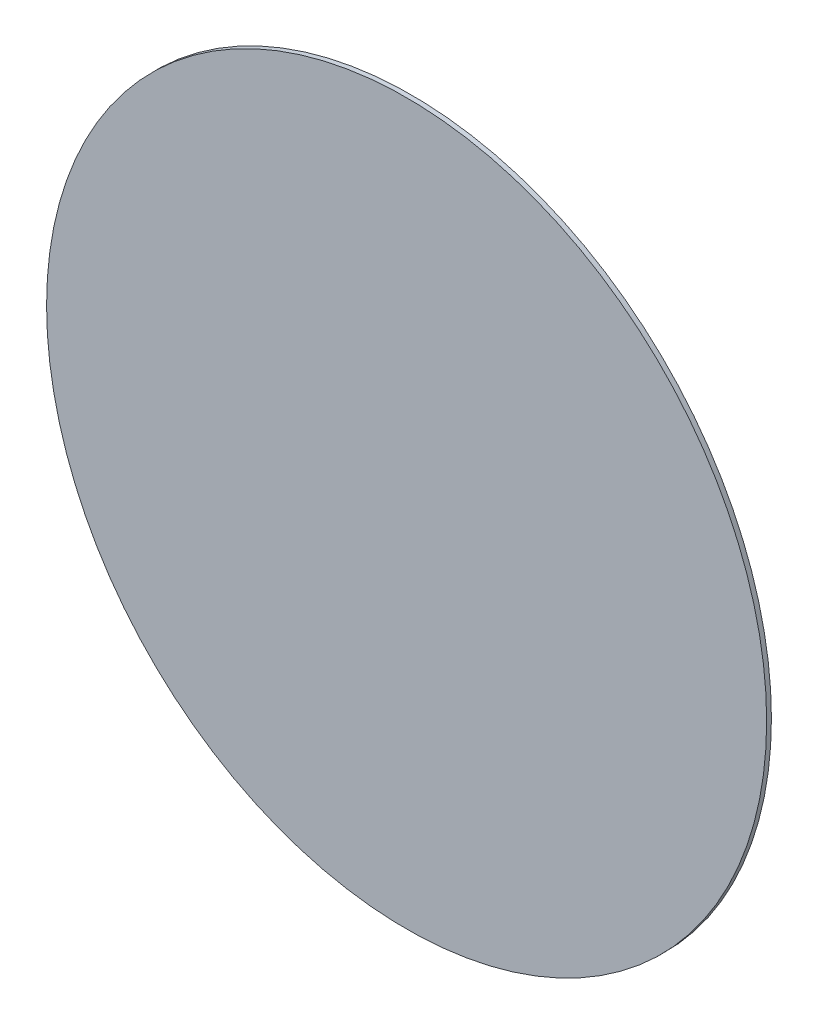
ISO-10303-21;
HEADER;
FILE_DESCRIPTION(('STEP AP214'),'2;1');
FILE_NAME('part.step','',(''),(''),'','','');
FILE_SCHEMA(('AUTOMOTIVE_DESIGN { 1 0 10303 214 1 1 1 1 }'));
ENDSEC;
DATA;
#1=APPLICATION_CONTEXT('core data for automotive mechanical design processes');
#2=APPLICATION_PROTOCOL_DEFINITION('international standard','automotive_design',2000,#1);
#3=PRODUCT_CONTEXT('',#1,'mechanical');
#4=PRODUCT('Part','Part','',(#3));
#5=PRODUCT_RELATED_PRODUCT_CATEGORY('part','',(#4));
#6=PRODUCT_DEFINITION_FORMATION('','',#4);
#7=PRODUCT_DEFINITION_CONTEXT('part definition',#1,'design');
#8=PRODUCT_DEFINITION('design','',#6,#7);
#9=PRODUCT_DEFINITION_SHAPE('','',#8);
#10=(LENGTH_UNIT() NAMED_UNIT(*) SI_UNIT(.MILLI.,.METRE.));
#11=(NAMED_UNIT(*) PLANE_ANGLE_UNIT() SI_UNIT($,.RADIAN.));
#12=(NAMED_UNIT(*) SI_UNIT($,.STERADIAN.) SOLID_ANGLE_UNIT());
#13=UNCERTAINTY_MEASURE_WITH_UNIT(LENGTH_MEASURE(1.E-05),#10,'distance_accuracy_value','');
#14=(GEOMETRIC_REPRESENTATION_CONTEXT(3) GLOBAL_UNCERTAINTY_ASSIGNED_CONTEXT((#13)) GLOBAL_UNIT_ASSIGNED_CONTEXT((#10,
#11,#12)) REPRESENTATION_CONTEXT('',''));
#15=CARTESIAN_POINT('',(0.,0.,0.));
#16=DIRECTION('',(0.,0.,1.));
#17=DIRECTION('',(1.,0.,0.));
#18=AXIS2_PLACEMENT_3D('',#15,#16,#17);
#19=CARTESIAN_POINT('',(0.,0.,3.));
#20=DIRECTION('',(0.,0.,1.));
#21=DIRECTION('',(1.,0.,0.));
#22=AXIS2_PLACEMENT_3D('',#19,#20,#21);
#23=PLANE('',#22);
#24=CARTESIAN_POINT('',(0.,0.,3.));
#25=DIRECTION('',(0.,0.,1.));
#26=DIRECTION('',(1.,0.,0.));
#27=AXIS2_PLACEMENT_3D('',#24,#25,#26);
#28=CIRCLE('',#27,226.5);
#29=CARTESIAN_POINT('',(-226.5,0.,3.));
#30=VERTEX_POINT('',#29);
#31=EDGE_CURVE('E26',#30,#30,#28,.T.);
#32=ORIENTED_EDGE('',*,*,#31,.T.);
#33=EDGE_LOOP('',(#32));
#34=FACE_BOUND('',#33,.T.);
#35=ADVANCED_FACE('F17',(#34),#23,.T.);
#36=CARTESIAN_POINT('',(0.,0.,0.));
#37=DIRECTION('',(0.,0.,1.));
#38=DIRECTION('',(1.,0.,0.));
#39=AXIS2_PLACEMENT_3D('',#36,#37,#38);
#40=CYLINDRICAL_SURFACE('',#39,226.5);
#41=ORIENTED_EDGE('',*,*,#31,.F.);
#42=DIRECTION('',(0.,0.,-1.));
#43=VECTOR('',#42,1.);
#44=CARTESIAN_POINT('',(-226.5,0.,0.));
#45=LINE('',#44,#43);
#46=CARTESIAN_POINT('',(-226.5,0.,0.));
#47=VERTEX_POINT('',#46);
#48=EDGE_CURVE('E11',#30,#47,#45,.T.);
#49=ORIENTED_EDGE('',*,*,#48,.T.);
#50=CARTESIAN_POINT('',(0.,0.,0.));
#51=DIRECTION('',(0.,0.,1.));
#52=DIRECTION('',(1.,0.,0.));
#53=AXIS2_PLACEMENT_3D('',#50,#51,#52);
#54=CIRCLE('',#53,226.5);
#55=EDGE_CURVE('E41',#47,#47,#54,.T.);
#56=ORIENTED_EDGE('',*,*,#55,.T.);
#57=ORIENTED_EDGE('',*,*,#48,.F.);
#58=EDGE_LOOP('',(#41,#49,#56,#57));
#59=FACE_BOUND('',#58,.T.);
#60=ADVANCED_FACE('F19',(#59),#40,.T.);
#61=CARTESIAN_POINT('',(0.,0.,0.));
#62=DIRECTION('',(0.,0.,1.));
#63=DIRECTION('',(1.,0.,0.));
#64=AXIS2_PLACEMENT_3D('',#61,#62,#63);
#65=PLANE('',#64);
#66=ORIENTED_EDGE('',*,*,#55,.F.);
#67=EDGE_LOOP('',(#66));
#68=FACE_BOUND('',#67,.T.);
#69=ADVANCED_FACE('F69',(#68),#65,.F.);
#70=CLOSED_SHELL('',(#35,#60,#69));
#71=MANIFOLD_SOLID_BREP('B1',#70);
#72=ADVANCED_BREP_SHAPE_REPRESENTATION('',(#18,#71),#14);
#73=SHAPE_DEFINITION_REPRESENTATION(#9,#72);
ENDSEC;
END-ISO-10303-21;
